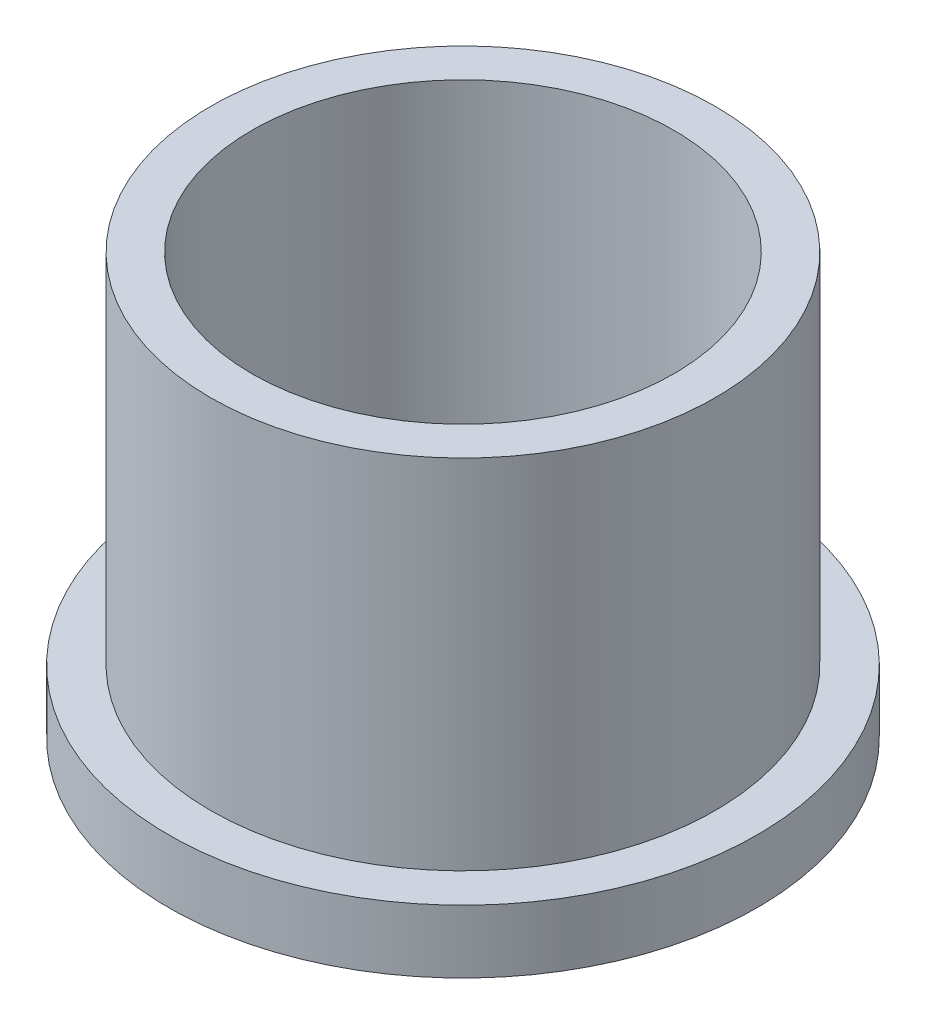
ISO-10303-21;
HEADER;
FILE_DESCRIPTION(('STEP AP214'),'2;1');
FILE_NAME('part.step','',(''),(''),'','','');
FILE_SCHEMA(('AUTOMOTIVE_DESIGN { 1 0 10303 214 1 1 1 1 }'));
ENDSEC;
DATA;
#1=APPLICATION_CONTEXT('core data for automotive mechanical design processes');
#2=APPLICATION_PROTOCOL_DEFINITION('international standard','automotive_design',2000,#1);
#3=PRODUCT_CONTEXT('',#1,'mechanical');
#4=PRODUCT('Part','Part','',(#3));
#5=PRODUCT_RELATED_PRODUCT_CATEGORY('part','',(#4));
#6=PRODUCT_DEFINITION_FORMATION('','',#4);
#7=PRODUCT_DEFINITION_CONTEXT('part definition',#1,'design');
#8=PRODUCT_DEFINITION('design','',#6,#7);
#9=PRODUCT_DEFINITION_SHAPE('','',#8);
#10=(LENGTH_UNIT() NAMED_UNIT(*) SI_UNIT(.MILLI.,.METRE.));
#11=(NAMED_UNIT(*) PLANE_ANGLE_UNIT() SI_UNIT($,.RADIAN.));
#12=(NAMED_UNIT(*) SI_UNIT($,.STERADIAN.) SOLID_ANGLE_UNIT());
#13=UNCERTAINTY_MEASURE_WITH_UNIT(LENGTH_MEASURE(1.E-05),#10,'distance_accuracy_value','');
#14=(GEOMETRIC_REPRESENTATION_CONTEXT(3) GLOBAL_UNCERTAINTY_ASSIGNED_CONTEXT((#13)) GLOBAL_UNIT_ASSIGNED_CONTEXT((#10,
#11,#12)) REPRESENTATION_CONTEXT('',''));
#15=CARTESIAN_POINT('',(0.,0.,0.));
#16=DIRECTION('',(0.,0.,1.));
#17=DIRECTION('',(1.,0.,0.));
#18=AXIS2_PLACEMENT_3D('',#15,#16,#17);
#19=CARTESIAN_POINT('',(0.,31.75,0.));
#20=DIRECTION('',(0.,1.,0.));
#21=DIRECTION('',(0.,0.,1.));
#22=AXIS2_PLACEMENT_3D('',#19,#20,#21);
#23=PLANE('',#22);
#24=CARTESIAN_POINT('',(0.,31.75,0.));
#25=DIRECTION('',(0.,1.,0.));
#26=DIRECTION('',(0.,0.,1.));
#27=AXIS2_PLACEMENT_3D('',#24,#25,#26);
#28=CIRCLE('',#27,19.05);
#29=CARTESIAN_POINT('',(0.,31.75,19.05));
#30=VERTEX_POINT('',#29);
#31=EDGE_CURVE('E10',#30,#30,#28,.T.);
#32=ORIENTED_EDGE('',*,*,#31,.T.);
#33=EDGE_LOOP('',(#32));
#34=FACE_BOUND('',#33,.T.);
#35=CARTESIAN_POINT('',(0.,31.75,0.));
#36=DIRECTION('',(0.,1.,0.));
#37=DIRECTION('',(0.,0.,1.));
#38=AXIS2_PLACEMENT_3D('',#35,#36,#37);
#39=CIRCLE('',#38,15.9258);
#40=CARTESIAN_POINT('',(0.,31.75,15.9258));
#41=VERTEX_POINT('',#40);
#42=EDGE_CURVE('E37',#41,#41,#39,.T.);
#43=ORIENTED_EDGE('',*,*,#42,.F.);
#44=EDGE_LOOP('',(#43));
#45=FACE_BOUND('',#44,.T.);
#46=ADVANCED_FACE('F30',(#34,#45),#23,.T.);
#47=CARTESIAN_POINT('',(0.,0.,0.));
#48=DIRECTION('',(0.,1.,0.));
#49=DIRECTION('',(0.,0.,1.));
#50=AXIS2_PLACEMENT_3D('',#47,#48,#49);
#51=PLANE('',#50);
#52=CARTESIAN_POINT('',(0.,0.,0.));
#53=DIRECTION('',(0.,1.,0.));
#54=DIRECTION('',(0.,0.,1.));
#55=AXIS2_PLACEMENT_3D('',#52,#53,#54);
#56=CIRCLE('',#55,15.9258);
#57=CARTESIAN_POINT('',(0.,0.,15.9258));
#58=VERTEX_POINT('',#57);
#59=EDGE_CURVE('E41',#58,#58,#56,.T.);
#60=ORIENTED_EDGE('',*,*,#59,.T.);
#61=EDGE_LOOP('',(#60));
#62=FACE_BOUND('',#61,.T.);
#63=CARTESIAN_POINT('',(0.,0.,0.));
#64=DIRECTION('',(0.,1.,0.));
#65=DIRECTION('',(0.,0.,1.));
#66=AXIS2_PLACEMENT_3D('',#63,#64,#65);
#67=CIRCLE('',#66,22.225);
#68=CARTESIAN_POINT('',(0.,0.,-22.225));
#69=VERTEX_POINT('',#68);
#70=EDGE_CURVE('E48',#69,#69,#67,.T.);
#71=ORIENTED_EDGE('',*,*,#70,.F.);
#72=EDGE_LOOP('',(#71));
#73=FACE_BOUND('',#72,.T.);
#74=ADVANCED_FACE('F73',(#62,#73),#51,.F.);
#75=CARTESIAN_POINT('',(0.,31.75,0.));
#76=DIRECTION('',(0.,-1.,0.));
#77=DIRECTION('',(0.,0.,-1.));
#78=AXIS2_PLACEMENT_3D('',#75,#76,#77);
#79=CYLINDRICAL_SURFACE('',#78,19.05);
#80=CARTESIAN_POINT('',(0.,4.7625,0.));
#81=DIRECTION('',(0.,1.,0.));
#82=DIRECTION('',(0.,0.,1.));
#83=AXIS2_PLACEMENT_3D('',#80,#81,#82);
#84=CIRCLE('',#83,19.05);
#85=CARTESIAN_POINT('',(0.,4.7625,19.05));
#86=VERTEX_POINT('',#85);
#87=EDGE_CURVE('E51',#86,#86,#84,.T.);
#88=ORIENTED_EDGE('',*,*,#87,.T.);
#89=EDGE_LOOP('',(#88));
#90=FACE_BOUND('',#89,.T.);
#91=ORIENTED_EDGE('',*,*,#31,.F.);
#92=EDGE_LOOP('',(#91));
#93=FACE_BOUND('',#92,.T.);
#94=ADVANCED_FACE('F32',(#90,#93),#79,.T.);
#95=CARTESIAN_POINT('',(0.,31.75,0.));
#96=DIRECTION('',(0.,-1.,0.));
#97=DIRECTION('',(0.,0.,-1.));
#98=AXIS2_PLACEMENT_3D('',#95,#96,#97);
#99=CYLINDRICAL_SURFACE('',#98,15.9258);
#100=ORIENTED_EDGE('',*,*,#42,.T.);
#101=EDGE_LOOP('',(#100));
#102=FACE_BOUND('',#101,.T.);
#103=ORIENTED_EDGE('',*,*,#59,.F.);
#104=EDGE_LOOP('',(#103));
#105=FACE_BOUND('',#104,.T.);
#106=ADVANCED_FACE('F62',(#102,#105),#99,.F.);
#107=CARTESIAN_POINT('',(0.,4.7625,0.));
#108=DIRECTION('',(0.,1.,0.));
#109=DIRECTION('',(0.,0.,1.));
#110=AXIS2_PLACEMENT_3D('',#107,#108,#109);
#111=PLANE('',#110);
#112=CARTESIAN_POINT('',(0.,4.7625,0.));
#113=DIRECTION('',(0.,1.,0.));
#114=DIRECTION('',(0.,0.,1.));
#115=AXIS2_PLACEMENT_3D('',#112,#113,#114);
#116=CIRCLE('',#115,22.225);
#117=CARTESIAN_POINT('',(0.,4.7625,-22.225));
#118=VERTEX_POINT('',#117);
#119=EDGE_CURVE('E46',#118,#118,#116,.T.);
#120=ORIENTED_EDGE('',*,*,#119,.T.);
#121=EDGE_LOOP('',(#120));
#122=FACE_BOUND('',#121,.T.);
#123=ORIENTED_EDGE('',*,*,#87,.F.);
#124=EDGE_LOOP('',(#123));
#125=FACE_BOUND('',#124,.T.);
#126=ADVANCED_FACE('F59',(#122,#125),#111,.T.);
#127=CARTESIAN_POINT('',(0.,4.7625,0.));
#128=DIRECTION('',(0.,-1.,0.));
#129=DIRECTION('',(0.,0.,-1.));
#130=AXIS2_PLACEMENT_3D('',#127,#128,#129);
#131=CYLINDRICAL_SURFACE('',#130,22.225);
#132=CARTESIAN_POINT('',(0.,4.7625,-22.225));
#133=CARTESIAN_POINT('',(0.,4.712890625,-22.225));
#134=CARTESIAN_POINT('',(0.,4.66328125,-22.225));
#135=CARTESIAN_POINT('',(0.,4.5640625,-22.225));
#136=CARTESIAN_POINT('',(0.,4.514453125,-22.225));
#137=CARTESIAN_POINT('',(0.,4.415234375,-22.225));
#138=CARTESIAN_POINT('',(0.,4.365625,-22.225));
#139=CARTESIAN_POINT('',(0.,4.26640625,-22.225));
#140=CARTESIAN_POINT('',(0.,4.216796875,-22.225));
#141=CARTESIAN_POINT('',(0.,4.117578125,-22.225));
#142=CARTESIAN_POINT('',(0.,4.06796875,-22.225));
#143=CARTESIAN_POINT('',(0.,3.96875,-22.225));
#144=CARTESIAN_POINT('',(0.,3.919140625,-22.225));
#145=CARTESIAN_POINT('',(0.,3.819921875,-22.225));
#146=CARTESIAN_POINT('',(0.,3.7703125,-22.225));
#147=CARTESIAN_POINT('',(0.,3.67109375,-22.225));
#148=CARTESIAN_POINT('',(0.,3.621484375,-22.225));
#149=CARTESIAN_POINT('',(0.,3.522265625,-22.225));
#150=CARTESIAN_POINT('',(0.,3.47265625,-22.225));
#151=CARTESIAN_POINT('',(0.,3.3734375,-22.225));
#152=CARTESIAN_POINT('',(0.,3.323828125,-22.225));
#153=CARTESIAN_POINT('',(0.,3.224609375,-22.225));
#154=CARTESIAN_POINT('',(0.,3.175,-22.225));
#155=CARTESIAN_POINT('',(0.,3.07578125,-22.225));
#156=CARTESIAN_POINT('',(0.,3.026171875,-22.225));
#157=CARTESIAN_POINT('',(0.,2.926953125,-22.225));
#158=CARTESIAN_POINT('',(0.,2.87734375,-22.225));
#159=CARTESIAN_POINT('',(0.,2.778125,-22.225));
#160=CARTESIAN_POINT('',(0.,2.728515625,-22.225));
#161=CARTESIAN_POINT('',(0.,2.629296875,-22.225));
#162=CARTESIAN_POINT('',(0.,2.5796875,-22.225));
#163=CARTESIAN_POINT('',(0.,2.48046875,-22.225));
#164=CARTESIAN_POINT('',(0.,2.430859375,-22.225));
#165=CARTESIAN_POINT('',(0.,2.331640625,-22.225));
#166=CARTESIAN_POINT('',(0.,2.28203125,-22.225));
#167=CARTESIAN_POINT('',(0.,2.1828125,-22.225));
#168=CARTESIAN_POINT('',(0.,2.133203125,-22.225));
#169=CARTESIAN_POINT('',(0.,2.033984375,-22.225));
#170=CARTESIAN_POINT('',(0.,1.984375,-22.225));
#171=CARTESIAN_POINT('',(0.,1.88515625,-22.225));
#172=CARTESIAN_POINT('',(0.,1.835546875,-22.225));
#173=CARTESIAN_POINT('',(0.,1.736328125,-22.225));
#174=CARTESIAN_POINT('',(0.,1.68671875,-22.225));
#175=CARTESIAN_POINT('',(0.,1.5875,-22.225));
#176=CARTESIAN_POINT('',(0.,1.537890625,-22.225));
#177=CARTESIAN_POINT('',(0.,1.438671875,-22.225));
#178=CARTESIAN_POINT('',(0.,1.3890625,-22.225));
#179=CARTESIAN_POINT('',(0.,1.28984375,-22.225));
#180=CARTESIAN_POINT('',(0.,1.240234375,-22.225));
#181=CARTESIAN_POINT('',(0.,1.141015625,-22.225));
#182=CARTESIAN_POINT('',(0.,1.09140625,-22.225));
#183=CARTESIAN_POINT('',(0.,0.992187499999999,-22.225));
#184=CARTESIAN_POINT('',(0.,0.942578124999999,-22.225));
#185=CARTESIAN_POINT('',(0.,0.843359375,-22.225));
#186=CARTESIAN_POINT('',(0.,0.79375,-22.225));
#187=CARTESIAN_POINT('',(0.,0.69453125,-22.225));
#188=CARTESIAN_POINT('',(0.,0.644921875,-22.225));
#189=CARTESIAN_POINT('',(0.,0.545703125,-22.225));
#190=CARTESIAN_POINT('',(0.,0.49609375,-22.225));
#191=CARTESIAN_POINT('',(0.,0.396875,-22.225));
#192=CARTESIAN_POINT('',(0.,0.347265625,-22.225));
#193=CARTESIAN_POINT('',(0.,0.248046875,-22.225));
#194=CARTESIAN_POINT('',(0.,0.1984375,-22.225));
#195=CARTESIAN_POINT('',(0.,0.09921875,-22.225));
#196=CARTESIAN_POINT('',(0.,0.049609375,-22.225));
#197=CARTESIAN_POINT('',(0.,0.,-22.225));
#198=B_SPLINE_CURVE_WITH_KNOTS('',3,(#132,#133,#134,#135,#136,#137,#138,#139,#140,#141,#142,
#143,#144,#145,#146,#147,#148,#149,#150,#151,#152,#153,#154,#155,#156,#157,#158,#159,#160,#161,
#162,#163,#164,#165,#166,#167,#168,#169,#170,#171,#172,#173,#174,#175,#176,#177,#178,#179,#180,
#181,#182,#183,#184,#185,#186,#187,#188,#189,#190,#191,#192,#193,#194,#195,#196,#197),
.UNSPECIFIED.,.F.,.F.,(4,2,2,2,2,2,2,2,2,2,2,2,2,2,2,2,2,2,2,2,2,2,2,2,2,2,2,2,2,2,2,2,4),(0.,
0.148828125,0.29765625,0.446484375,0.5953125,0.744140625,0.892968750000001,1.041796875,1.190625,
1.339453125,1.48828125,1.637109375,1.7859375,1.934765625,2.08359375,2.232421875,2.38125,
2.530078125,2.67890625,2.827734375,2.9765625,3.125390625,3.27421875,3.423046875,3.571875,
3.720703125,3.86953125,4.018359375,4.1671875,4.316015625,4.46484375,4.613671875,4.7625),.UNSPECIFIED.);
#199=EDGE_CURVE('BSEAM61',#118,#69,#198,.T.);
#200=ORIENTED_EDGE('',*,*,#119,.F.);
#201=ORIENTED_EDGE('',*,*,#70,.T.);
#202=ORIENTED_EDGE('',*,*,#199,.T.);
#203=ORIENTED_EDGE('',*,*,#199,.F.);
#204=EDGE_LOOP('',(#200,#202,#201,#203));
#205=FACE_BOUND('',#204,.T.);
#206=ADVANCED_FACE('F61',(#205),#131,.T.);
#207=CLOSED_SHELL('',(#46,#74,#94,#106,#126,#206));
#208=MANIFOLD_SOLID_BREP('B2',#207);
#209=ADVANCED_BREP_SHAPE_REPRESENTATION('',(#18,#208),#14);
#210=SHAPE_DEFINITION_REPRESENTATION(#9,#209);
ENDSEC;
END-ISO-10303-21;
